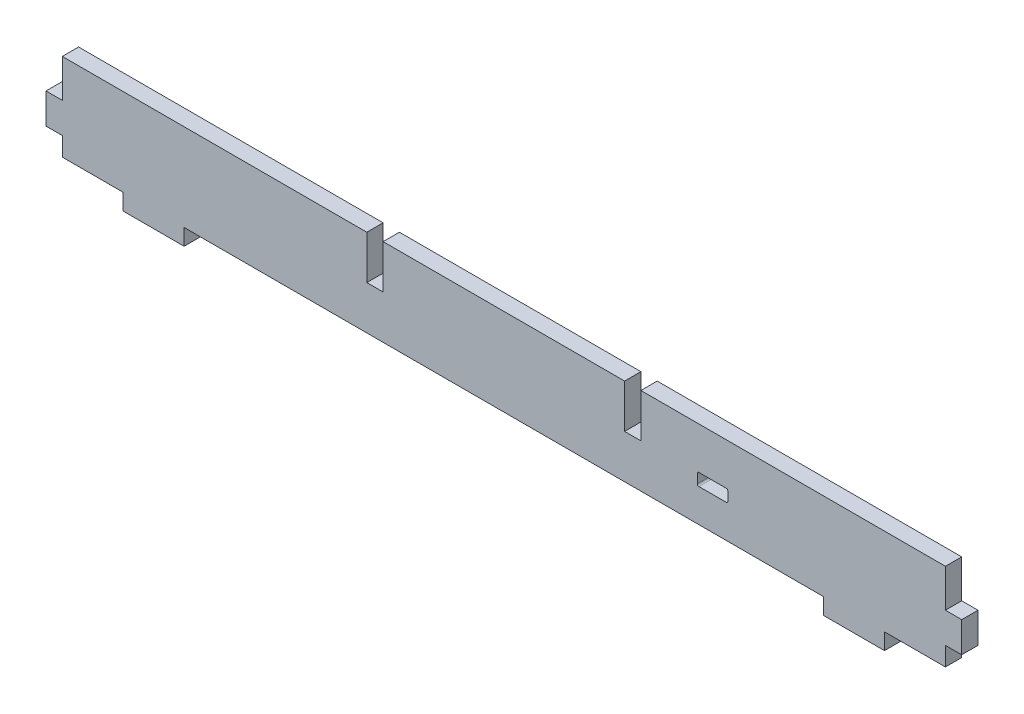
ISO-10303-21;
HEADER;
FILE_DESCRIPTION(('STEP AP214'),'2;1');
FILE_NAME('part.step','',(''),(''),'','','');
FILE_SCHEMA(('AUTOMOTIVE_DESIGN { 1 0 10303 214 1 1 1 1 }'));
ENDSEC;
DATA;
#1=APPLICATION_CONTEXT('core data for automotive mechanical design processes');
#2=APPLICATION_PROTOCOL_DEFINITION('international standard','automotive_design',2000,#1);
#3=PRODUCT_CONTEXT('',#1,'mechanical');
#4=PRODUCT('Part','Part','',(#3));
#5=PRODUCT_RELATED_PRODUCT_CATEGORY('part','',(#4));
#6=PRODUCT_DEFINITION_FORMATION('','',#4);
#7=PRODUCT_DEFINITION_CONTEXT('part definition',#1,'design');
#8=PRODUCT_DEFINITION('design','',#6,#7);
#9=PRODUCT_DEFINITION_SHAPE('','',#8);
#10=(LENGTH_UNIT() NAMED_UNIT(*) SI_UNIT(.MILLI.,.METRE.));
#11=(NAMED_UNIT(*) PLANE_ANGLE_UNIT() SI_UNIT($,.RADIAN.));
#12=(NAMED_UNIT(*) SI_UNIT($,.STERADIAN.) SOLID_ANGLE_UNIT());
#13=UNCERTAINTY_MEASURE_WITH_UNIT(LENGTH_MEASURE(1.E-05),#10,'distance_accuracy_value','');
#14=(GEOMETRIC_REPRESENTATION_CONTEXT(3) GLOBAL_UNCERTAINTY_ASSIGNED_CONTEXT((#13)) GLOBAL_UNIT_ASSIGNED_CONTEXT((#10,
#11,#12)) REPRESENTATION_CONTEXT('',''));
#15=CARTESIAN_POINT('',(0.,0.,0.));
#16=DIRECTION('',(0.,0.,1.));
#17=DIRECTION('',(1.,0.,0.));
#18=AXIS2_PLACEMENT_3D('',#15,#16,#17);
#19=CARTESIAN_POINT('',(0.,0.,5.35));
#20=DIRECTION('',(0.,0.,1.));
#21=DIRECTION('',(1.,0.,0.));
#22=AXIS2_PLACEMENT_3D('',#19,#20,#21);
#23=PLANE('',#22);
#24=DIRECTION('',(0.,-1.,0.));
#25=VECTOR('',#24,1.);
#26=CARTESIAN_POINT('',(-145.,0.,5.35));
#27=LINE('',#26,#25);
#28=CARTESIAN_POINT('',(-145.,6.15,5.35));
#29=VERTEX_POINT('',#28);
#30=CARTESIAN_POINT('',(-145.,0.,5.35));
#31=VERTEX_POINT('',#30);
#32=EDGE_CURVE('E330',#29,#31,#27,.T.);
#33=ORIENTED_EDGE('',*,*,#32,.T.);
#34=DIRECTION('',(1.,0.,0.));
#35=VECTOR('',#34,1.);
#36=CARTESIAN_POINT('',(-145.,0.,5.35));
#37=LINE('',#36,#35);
#38=CARTESIAN_POINT('',(-125.,0.,5.35));
#39=VERTEX_POINT('',#38);
#40=EDGE_CURVE('E333',#31,#39,#37,.T.);
#41=ORIENTED_EDGE('',*,*,#40,.T.);
#42=DIRECTION('',(0.,-1.,0.));
#43=VECTOR('',#42,1.);
#44=CARTESIAN_POINT('',(-125.,0.,5.35));
#45=LINE('',#44,#43);
#46=CARTESIAN_POINT('',(-125.,-5.35,5.35));
#47=VERTEX_POINT('',#46);
#48=EDGE_CURVE('E336',#39,#47,#45,.T.);
#49=ORIENTED_EDGE('',*,*,#48,.T.);
#50=DIRECTION('',(1.,0.,0.));
#51=VECTOR('',#50,1.);
#52=CARTESIAN_POINT('',(-125.,-5.35,5.35));
#53=LINE('',#52,#51);
#54=CARTESIAN_POINT('',(-105.,-5.35,5.35));
#55=VERTEX_POINT('',#54);
#56=EDGE_CURVE('E338',#47,#55,#53,.T.);
#57=ORIENTED_EDGE('',*,*,#56,.T.);
#58=DIRECTION('',(0.,1.,0.));
#59=VECTOR('',#58,1.);
#60=CARTESIAN_POINT('',(-105.,0.,5.35));
#61=LINE('',#60,#59);
#62=CARTESIAN_POINT('',(-105.,0.,5.35));
#63=VERTEX_POINT('',#62);
#64=EDGE_CURVE('E340',#55,#63,#61,.T.);
#65=ORIENTED_EDGE('',*,*,#64,.T.);
#66=DIRECTION('',(1.,0.,0.));
#67=VECTOR('',#66,1.);
#68=CARTESIAN_POINT('',(-105.,0.,5.35));
#69=LINE('',#68,#67);
#70=CARTESIAN_POINT('',(105.,0.,5.35));
#71=VERTEX_POINT('',#70);
#72=EDGE_CURVE('E342',#63,#71,#69,.T.);
#73=ORIENTED_EDGE('',*,*,#72,.T.);
#74=DIRECTION('',(0.,-1.,0.));
#75=VECTOR('',#74,1.);
#76=CARTESIAN_POINT('',(105.,0.,5.35));
#77=LINE('',#76,#75);
#78=CARTESIAN_POINT('',(105.,-5.35,5.35));
#79=VERTEX_POINT('',#78);
#80=EDGE_CURVE('E344',#71,#79,#77,.T.);
#81=ORIENTED_EDGE('',*,*,#80,.T.);
#82=DIRECTION('',(1.,0.,0.));
#83=VECTOR('',#82,1.);
#84=CARTESIAN_POINT('',(125.,-5.35,5.35));
#85=LINE('',#84,#83);
#86=CARTESIAN_POINT('',(125.,-5.35,5.35));
#87=VERTEX_POINT('',#86);
#88=EDGE_CURVE('E346',#79,#87,#85,.T.);
#89=ORIENTED_EDGE('',*,*,#88,.T.);
#90=DIRECTION('',(0.,1.,0.));
#91=VECTOR('',#90,1.);
#92=CARTESIAN_POINT('',(125.,0.,5.35));
#93=LINE('',#92,#91);
#94=CARTESIAN_POINT('',(125.,0.,5.35));
#95=VERTEX_POINT('',#94);
#96=EDGE_CURVE('E348',#87,#95,#93,.T.);
#97=ORIENTED_EDGE('',*,*,#96,.T.);
#98=DIRECTION('',(1.,0.,0.));
#99=VECTOR('',#98,1.);
#100=CARTESIAN_POINT('',(125.,0.,5.35));
#101=LINE('',#100,#99);
#102=CARTESIAN_POINT('',(145.,0.,5.35));
#103=VERTEX_POINT('',#102);
#104=EDGE_CURVE('E350',#95,#103,#101,.T.);
#105=ORIENTED_EDGE('',*,*,#104,.T.);
#106=DIRECTION('',(0.,1.,0.));
#107=VECTOR('',#106,1.);
#108=CARTESIAN_POINT('',(145.,0.,5.35));
#109=LINE('',#108,#107);
#110=CARTESIAN_POINT('',(145.,6.15,5.35));
#111=VERTEX_POINT('',#110);
#112=EDGE_CURVE('E352',#103,#111,#109,.T.);
#113=ORIENTED_EDGE('',*,*,#112,.T.);
#114=DIRECTION('',(1.,0.,0.));
#115=VECTOR('',#114,1.);
#116=CARTESIAN_POINT('',(145.,6.15,5.35));
#117=LINE('',#116,#115);
#118=CARTESIAN_POINT('',(150.35,6.15,5.35));
#119=VERTEX_POINT('',#118);
#120=EDGE_CURVE('E354',#111,#119,#117,.T.);
#121=ORIENTED_EDGE('',*,*,#120,.T.);
#122=DIRECTION('',(0.,1.,0.));
#123=VECTOR('',#122,1.);
#124=CARTESIAN_POINT('',(150.35,6.15,5.35));
#125=LINE('',#124,#123);
#126=CARTESIAN_POINT('',(150.35,16.15,5.35));
#127=VERTEX_POINT('',#126);
#128=EDGE_CURVE('E356',#119,#127,#125,.T.);
#129=ORIENTED_EDGE('',*,*,#128,.T.);
#130=DIRECTION('',(-1.,0.,0.));
#131=VECTOR('',#130,1.);
#132=CARTESIAN_POINT('',(145.,16.15,5.35));
#133=LINE('',#132,#131);
#134=CARTESIAN_POINT('',(145.,16.15,5.35));
#135=VERTEX_POINT('',#134);
#136=EDGE_CURVE('E358',#127,#135,#133,.T.);
#137=ORIENTED_EDGE('',*,*,#136,.T.);
#138=DIRECTION('',(0.,1.,0.));
#139=VECTOR('',#138,1.);
#140=CARTESIAN_POINT('',(145.,16.15,5.35));
#141=LINE('',#140,#139);
#142=CARTESIAN_POINT('',(145.,28.65,5.35));
#143=VERTEX_POINT('',#142);
#144=EDGE_CURVE('E360',#135,#143,#141,.T.);
#145=ORIENTED_EDGE('',*,*,#144,.T.);
#146=DIRECTION('',(-1.,0.,0.));
#147=VECTOR('',#146,1.);
#148=CARTESIAN_POINT('',(45.,28.65,5.35));
#149=LINE('',#148,#147);
#150=CARTESIAN_POINT('',(45.,28.65,5.35));
#151=VERTEX_POINT('',#150);
#152=EDGE_CURVE('E362',#143,#151,#149,.T.);
#153=ORIENTED_EDGE('',*,*,#152,.T.);
#154=DIRECTION('',(0.,-1.,0.));
#155=VECTOR('',#154,1.);
#156=CARTESIAN_POINT('',(45.,28.65,5.35));
#157=LINE('',#156,#155);
#158=CARTESIAN_POINT('',(45.,14.325,5.35));
#159=VERTEX_POINT('',#158);
#160=EDGE_CURVE('E364',#151,#159,#157,.T.);
#161=ORIENTED_EDGE('',*,*,#160,.T.);
#162=DIRECTION('',(-1.,0.,0.));
#163=VECTOR('',#162,1.);
#164=CARTESIAN_POINT('',(45.,14.325,5.35));
#165=LINE('',#164,#163);
#166=CARTESIAN_POINT('',(39.65,14.325,5.35));
#167=VERTEX_POINT('',#166);
#168=EDGE_CURVE('E366',#159,#167,#165,.T.);
#169=ORIENTED_EDGE('',*,*,#168,.T.);
#170=DIRECTION('',(0.,1.,0.));
#171=VECTOR('',#170,1.);
#172=CARTESIAN_POINT('',(39.65,28.65,5.35));
#173=LINE('',#172,#171);
#174=CARTESIAN_POINT('',(39.65,28.65,5.35));
#175=VERTEX_POINT('',#174);
#176=EDGE_CURVE('E368',#167,#175,#173,.T.);
#177=ORIENTED_EDGE('',*,*,#176,.T.);
#178=DIRECTION('',(-1.,0.,0.));
#179=VECTOR('',#178,1.);
#180=CARTESIAN_POINT('',(-39.65,28.65,5.35));
#181=LINE('',#180,#179);
#182=CARTESIAN_POINT('',(-39.65,28.65,5.35));
#183=VERTEX_POINT('',#182);
#184=EDGE_CURVE('E370',#175,#183,#181,.T.);
#185=ORIENTED_EDGE('',*,*,#184,.T.);
#186=DIRECTION('',(0.,-1.,0.));
#187=VECTOR('',#186,1.);
#188=CARTESIAN_POINT('',(-39.65,28.65,5.35));
#189=LINE('',#188,#187);
#190=CARTESIAN_POINT('',(-39.65,14.325,5.35));
#191=VERTEX_POINT('',#190);
#192=EDGE_CURVE('E372',#183,#191,#189,.T.);
#193=ORIENTED_EDGE('',*,*,#192,.T.);
#194=DIRECTION('',(-1.,0.,0.));
#195=VECTOR('',#194,1.);
#196=CARTESIAN_POINT('',(-45.,14.325,5.35));
#197=LINE('',#196,#195);
#198=CARTESIAN_POINT('',(-45.,14.325,5.35));
#199=VERTEX_POINT('',#198);
#200=EDGE_CURVE('E374',#191,#199,#197,.T.);
#201=ORIENTED_EDGE('',*,*,#200,.T.);
#202=DIRECTION('',(0.,1.,0.));
#203=VECTOR('',#202,1.);
#204=CARTESIAN_POINT('',(-45.,28.65,5.35));
#205=LINE('',#204,#203);
#206=CARTESIAN_POINT('',(-45.,28.65,5.35));
#207=VERTEX_POINT('',#206);
#208=EDGE_CURVE('E376',#199,#207,#205,.T.);
#209=ORIENTED_EDGE('',*,*,#208,.T.);
#210=DIRECTION('',(-1.,0.,0.));
#211=VECTOR('',#210,1.);
#212=CARTESIAN_POINT('',(-145.,28.65,5.35));
#213=LINE('',#212,#211);
#214=CARTESIAN_POINT('',(-145.,28.65,5.35));
#215=VERTEX_POINT('',#214);
#216=EDGE_CURVE('E378',#207,#215,#213,.T.);
#217=ORIENTED_EDGE('',*,*,#216,.T.);
#218=DIRECTION('',(0.,-1.,0.));
#219=VECTOR('',#218,1.);
#220=CARTESIAN_POINT('',(-145.,16.15,5.35));
#221=LINE('',#220,#219);
#222=CARTESIAN_POINT('',(-145.,16.15,5.35));
#223=VERTEX_POINT('',#222);
#224=EDGE_CURVE('E380',#215,#223,#221,.T.);
#225=ORIENTED_EDGE('',*,*,#224,.T.);
#226=DIRECTION('',(-1.,0.,0.));
#227=VECTOR('',#226,1.);
#228=CARTESIAN_POINT('',(-145.,16.15,5.35));
#229=LINE('',#228,#227);
#230=CARTESIAN_POINT('',(-150.35,16.15,5.35));
#231=VERTEX_POINT('',#230);
#232=EDGE_CURVE('E382',#223,#231,#229,.T.);
#233=ORIENTED_EDGE('',*,*,#232,.T.);
#234=DIRECTION('',(0.,-1.,0.));
#235=VECTOR('',#234,1.);
#236=CARTESIAN_POINT('',(-150.35,6.15,5.35));
#237=LINE('',#236,#235);
#238=CARTESIAN_POINT('',(-150.35,6.15,5.35));
#239=VERTEX_POINT('',#238);
#240=EDGE_CURVE('E384',#231,#239,#237,.T.);
#241=ORIENTED_EDGE('',*,*,#240,.T.);
#242=DIRECTION('',(1.,0.,0.));
#243=VECTOR('',#242,1.);
#244=CARTESIAN_POINT('',(-145.,6.15,5.35));
#245=LINE('',#244,#243);
#246=EDGE_CURVE('E386',#239,#29,#245,.T.);
#247=ORIENTED_EDGE('',*,*,#246,.T.);
#248=EDGE_LOOP('',(#33,#41,#49,#57,#65,#73,#81,#89,#97,#105,#113,#121,#129,#137,#145,#153,#161,
#169,#177,#185,#193,#201,#209,#217,#225,#233,#241,#247));
#249=FACE_BOUND('',#248,.T.);
#250=DIRECTION('',(1.,0.,0.));
#251=VECTOR('',#250,1.);
#252=CARTESIAN_POINT('',(64.04,10.85,5.35));
#253=LINE('',#252,#251);
#254=CARTESIAN_POINT('',(64.04,10.85,5.35));
#255=VERTEX_POINT('',#254);
#256=CARTESIAN_POINT('',(73.04,10.85,5.35));
#257=VERTEX_POINT('',#256);
#258=EDGE_CURVE('E273',#255,#257,#253,.T.);
#259=ORIENTED_EDGE('',*,*,#258,.F.);
#260=CARTESIAN_POINT('',(64.04,11.35,5.35));
#261=DIRECTION('',(0.,0.,1.));
#262=DIRECTION('',(1.,0.,0.));
#263=AXIS2_PLACEMENT_3D('',#260,#261,#262);
#264=CIRCLE('',#263,0.500000000000001);
#265=CARTESIAN_POINT('',(63.54,11.35,5.35));
#266=VERTEX_POINT('',#265);
#267=EDGE_CURVE('E265',#266,#255,#264,.T.);
#268=ORIENTED_EDGE('',*,*,#267,.F.);
#269=DIRECTION('',(0.,-1.,0.));
#270=VECTOR('',#269,1.);
#271=CARTESIAN_POINT('',(63.54,14.35,5.35));
#272=LINE('',#271,#270);
#273=CARTESIAN_POINT('',(63.54,14.35,5.35));
#274=VERTEX_POINT('',#273);
#275=EDGE_CURVE('E298',#274,#266,#272,.T.);
#276=ORIENTED_EDGE('',*,*,#275,.F.);
#277=CARTESIAN_POINT('',(64.04,14.35,5.35));
#278=DIRECTION('',(0.,0.,1.));
#279=DIRECTION('',(1.,0.,0.));
#280=AXIS2_PLACEMENT_3D('',#277,#278,#279);
#281=CIRCLE('',#280,0.5);
#282=CARTESIAN_POINT('',(64.04,14.85,5.35));
#283=VERTEX_POINT('',#282);
#284=EDGE_CURVE('E296',#283,#274,#281,.T.);
#285=ORIENTED_EDGE('',*,*,#284,.F.);
#286=DIRECTION('',(-1.,0.,0.));
#287=VECTOR('',#286,1.);
#288=CARTESIAN_POINT('',(64.04,14.85,5.35));
#289=LINE('',#288,#287);
#290=CARTESIAN_POINT('',(73.04,14.85,5.35));
#291=VERTEX_POINT('',#290);
#292=EDGE_CURVE('E294',#291,#283,#289,.T.);
#293=ORIENTED_EDGE('',*,*,#292,.F.);
#294=CARTESIAN_POINT('',(73.04,14.35,5.35));
#295=DIRECTION('',(0.,0.,1.));
#296=DIRECTION('',(1.,0.,0.));
#297=AXIS2_PLACEMENT_3D('',#294,#295,#296);
#298=CIRCLE('',#297,0.5);
#299=CARTESIAN_POINT('',(73.54,14.35,5.35));
#300=VERTEX_POINT('',#299);
#301=EDGE_CURVE('E292',#300,#291,#298,.T.);
#302=ORIENTED_EDGE('',*,*,#301,.F.);
#303=DIRECTION('',(0.,1.,0.));
#304=VECTOR('',#303,1.);
#305=CARTESIAN_POINT('',(73.54,14.35,5.35));
#306=LINE('',#305,#304);
#307=CARTESIAN_POINT('',(73.54,11.35,5.35));
#308=VERTEX_POINT('',#307);
#309=EDGE_CURVE('E288',#308,#300,#306,.T.);
#310=ORIENTED_EDGE('',*,*,#309,.F.);
#311=CARTESIAN_POINT('',(73.04,11.35,5.35));
#312=DIRECTION('',(0.,0.,1.));
#313=DIRECTION('',(1.,0.,0.));
#314=AXIS2_PLACEMENT_3D('',#311,#312,#313);
#315=CIRCLE('',#314,0.500000000000001);
#316=EDGE_CURVE('E286',#257,#308,#315,.T.);
#317=ORIENTED_EDGE('',*,*,#316,.F.);
#318=EDGE_LOOP('',(#259,#268,#276,#285,#293,#302,#310,#317));
#319=FACE_BOUND('',#318,.T.);
#320=ADVANCED_FACE('F32',(#249,#319),#23,.T.);
#321=CARTESIAN_POINT('',(0.,0.,0.));
#322=DIRECTION('',(0.,0.,1.));
#323=DIRECTION('',(1.,0.,0.));
#324=AXIS2_PLACEMENT_3D('',#321,#322,#323);
#325=PLANE('',#324);
#326=DIRECTION('',(0.,-1.,0.));
#327=VECTOR('',#326,1.);
#328=CARTESIAN_POINT('',(-145.,0.,0.));
#329=LINE('',#328,#327);
#330=CARTESIAN_POINT('',(-145.,6.15,0.));
#331=VERTEX_POINT('',#330);
#332=CARTESIAN_POINT('',(-145.,0.,0.));
#333=VERTEX_POINT('',#332);
#334=EDGE_CURVE('E281',#331,#333,#329,.T.);
#335=ORIENTED_EDGE('',*,*,#334,.F.);
#336=DIRECTION('',(1.,0.,0.));
#337=VECTOR('',#336,1.);
#338=CARTESIAN_POINT('',(-145.,6.15,0.));
#339=LINE('',#338,#337);
#340=CARTESIAN_POINT('',(-150.35,6.15,0.));
#341=VERTEX_POINT('',#340);
#342=EDGE_CURVE('E334',#341,#331,#339,.T.);
#343=ORIENTED_EDGE('',*,*,#342,.F.);
#344=DIRECTION('',(0.,-1.,0.));
#345=VECTOR('',#344,1.);
#346=CARTESIAN_POINT('',(-150.35,6.15,0.));
#347=LINE('',#346,#345);
#348=CARTESIAN_POINT('',(-150.35,16.15,0.));
#349=VERTEX_POINT('',#348);
#350=EDGE_CURVE('E441',#349,#341,#347,.T.);
#351=ORIENTED_EDGE('',*,*,#350,.F.);
#352=DIRECTION('',(-1.,0.,0.));
#353=VECTOR('',#352,1.);
#354=CARTESIAN_POINT('',(-145.,16.15,0.));
#355=LINE('',#354,#353);
#356=CARTESIAN_POINT('',(-145.,16.15,0.));
#357=VERTEX_POINT('',#356);
#358=EDGE_CURVE('E439',#357,#349,#355,.T.);
#359=ORIENTED_EDGE('',*,*,#358,.F.);
#360=DIRECTION('',(0.,-1.,0.));
#361=VECTOR('',#360,1.);
#362=CARTESIAN_POINT('',(-145.,16.15,0.));
#363=LINE('',#362,#361);
#364=CARTESIAN_POINT('',(-145.,28.65,0.));
#365=VERTEX_POINT('',#364);
#366=EDGE_CURVE('E437',#365,#357,#363,.T.);
#367=ORIENTED_EDGE('',*,*,#366,.F.);
#368=DIRECTION('',(-1.,0.,0.));
#369=VECTOR('',#368,1.);
#370=CARTESIAN_POINT('',(-145.,28.65,0.));
#371=LINE('',#370,#369);
#372=CARTESIAN_POINT('',(-45.,28.65,0.));
#373=VERTEX_POINT('',#372);
#374=EDGE_CURVE('E435',#373,#365,#371,.T.);
#375=ORIENTED_EDGE('',*,*,#374,.F.);
#376=DIRECTION('',(0.,1.,0.));
#377=VECTOR('',#376,1.);
#378=CARTESIAN_POINT('',(-45.,28.65,0.));
#379=LINE('',#378,#377);
#380=CARTESIAN_POINT('',(-45.,14.325,0.));
#381=VERTEX_POINT('',#380);
#382=EDGE_CURVE('E433',#381,#373,#379,.T.);
#383=ORIENTED_EDGE('',*,*,#382,.F.);
#384=DIRECTION('',(-1.,0.,0.));
#385=VECTOR('',#384,1.);
#386=CARTESIAN_POINT('',(-45.,14.325,0.));
#387=LINE('',#386,#385);
#388=CARTESIAN_POINT('',(-39.65,14.325,0.));
#389=VERTEX_POINT('',#388);
#390=EDGE_CURVE('E431',#389,#381,#387,.T.);
#391=ORIENTED_EDGE('',*,*,#390,.F.);
#392=DIRECTION('',(0.,-1.,0.));
#393=VECTOR('',#392,1.);
#394=CARTESIAN_POINT('',(-39.65,28.65,0.));
#395=LINE('',#394,#393);
#396=CARTESIAN_POINT('',(-39.65,28.65,0.));
#397=VERTEX_POINT('',#396);
#398=EDGE_CURVE('E429',#397,#389,#395,.T.);
#399=ORIENTED_EDGE('',*,*,#398,.F.);
#400=DIRECTION('',(-1.,0.,0.));
#401=VECTOR('',#400,1.);
#402=CARTESIAN_POINT('',(-39.65,28.65,0.));
#403=LINE('',#402,#401);
#404=CARTESIAN_POINT('',(39.65,28.65,0.));
#405=VERTEX_POINT('',#404);
#406=EDGE_CURVE('E427',#405,#397,#403,.T.);
#407=ORIENTED_EDGE('',*,*,#406,.F.);
#408=DIRECTION('',(0.,1.,0.));
#409=VECTOR('',#408,1.);
#410=CARTESIAN_POINT('',(39.65,28.65,0.));
#411=LINE('',#410,#409);
#412=CARTESIAN_POINT('',(39.65,14.325,0.));
#413=VERTEX_POINT('',#412);
#414=EDGE_CURVE('E425',#413,#405,#411,.T.);
#415=ORIENTED_EDGE('',*,*,#414,.F.);
#416=DIRECTION('',(-1.,0.,0.));
#417=VECTOR('',#416,1.);
#418=CARTESIAN_POINT('',(45.,14.325,0.));
#419=LINE('',#418,#417);
#420=CARTESIAN_POINT('',(45.,14.325,0.));
#421=VERTEX_POINT('',#420);
#422=EDGE_CURVE('E423',#421,#413,#419,.T.);
#423=ORIENTED_EDGE('',*,*,#422,.F.);
#424=DIRECTION('',(0.,-1.,0.));
#425=VECTOR('',#424,1.);
#426=CARTESIAN_POINT('',(45.,28.65,0.));
#427=LINE('',#426,#425);
#428=CARTESIAN_POINT('',(45.,28.65,0.));
#429=VERTEX_POINT('',#428);
#430=EDGE_CURVE('E421',#429,#421,#427,.T.);
#431=ORIENTED_EDGE('',*,*,#430,.F.);
#432=DIRECTION('',(-1.,0.,0.));
#433=VECTOR('',#432,1.);
#434=CARTESIAN_POINT('',(45.,28.65,0.));
#435=LINE('',#434,#433);
#436=CARTESIAN_POINT('',(145.,28.65,0.));
#437=VERTEX_POINT('',#436);
#438=EDGE_CURVE('E419',#437,#429,#435,.T.);
#439=ORIENTED_EDGE('',*,*,#438,.F.);
#440=DIRECTION('',(0.,1.,0.));
#441=VECTOR('',#440,1.);
#442=CARTESIAN_POINT('',(145.,16.15,0.));
#443=LINE('',#442,#441);
#444=CARTESIAN_POINT('',(145.,16.15,0.));
#445=VERTEX_POINT('',#444);
#446=EDGE_CURVE('E417',#445,#437,#443,.T.);
#447=ORIENTED_EDGE('',*,*,#446,.F.);
#448=DIRECTION('',(-1.,0.,0.));
#449=VECTOR('',#448,1.);
#450=CARTESIAN_POINT('',(145.,16.15,0.));
#451=LINE('',#450,#449);
#452=CARTESIAN_POINT('',(150.35,16.15,0.));
#453=VERTEX_POINT('',#452);
#454=EDGE_CURVE('E415',#453,#445,#451,.T.);
#455=ORIENTED_EDGE('',*,*,#454,.F.);
#456=DIRECTION('',(0.,1.,0.));
#457=VECTOR('',#456,1.);
#458=CARTESIAN_POINT('',(150.35,6.15,0.));
#459=LINE('',#458,#457);
#460=CARTESIAN_POINT('',(150.35,6.15,0.));
#461=VERTEX_POINT('',#460);
#462=EDGE_CURVE('E413',#461,#453,#459,.T.);
#463=ORIENTED_EDGE('',*,*,#462,.F.);
#464=DIRECTION('',(1.,0.,0.));
#465=VECTOR('',#464,1.);
#466=CARTESIAN_POINT('',(145.,6.15,0.));
#467=LINE('',#466,#465);
#468=CARTESIAN_POINT('',(145.,6.15,0.));
#469=VERTEX_POINT('',#468);
#470=EDGE_CURVE('E411',#469,#461,#467,.T.);
#471=ORIENTED_EDGE('',*,*,#470,.F.);
#472=DIRECTION('',(0.,1.,0.));
#473=VECTOR('',#472,1.);
#474=CARTESIAN_POINT('',(145.,0.,0.));
#475=LINE('',#474,#473);
#476=CARTESIAN_POINT('',(145.,0.,0.));
#477=VERTEX_POINT('',#476);
#478=EDGE_CURVE('E409',#477,#469,#475,.T.);
#479=ORIENTED_EDGE('',*,*,#478,.F.);
#480=DIRECTION('',(1.,0.,0.));
#481=VECTOR('',#480,1.);
#482=CARTESIAN_POINT('',(125.,0.,0.));
#483=LINE('',#482,#481);
#484=CARTESIAN_POINT('',(125.,0.,0.));
#485=VERTEX_POINT('',#484);
#486=EDGE_CURVE('E407',#485,#477,#483,.T.);
#487=ORIENTED_EDGE('',*,*,#486,.F.);
#488=DIRECTION('',(0.,1.,0.));
#489=VECTOR('',#488,1.);
#490=CARTESIAN_POINT('',(125.,0.,0.));
#491=LINE('',#490,#489);
#492=CARTESIAN_POINT('',(125.,-5.35,0.));
#493=VERTEX_POINT('',#492);
#494=EDGE_CURVE('E405',#493,#485,#491,.T.);
#495=ORIENTED_EDGE('',*,*,#494,.F.);
#496=DIRECTION('',(1.,0.,0.));
#497=VECTOR('',#496,1.);
#498=CARTESIAN_POINT('',(125.,-5.35,0.));
#499=LINE('',#498,#497);
#500=CARTESIAN_POINT('',(105.,-5.35,0.));
#501=VERTEX_POINT('',#500);
#502=EDGE_CURVE('E403',#501,#493,#499,.T.);
#503=ORIENTED_EDGE('',*,*,#502,.F.);
#504=DIRECTION('',(0.,-1.,0.));
#505=VECTOR('',#504,1.);
#506=CARTESIAN_POINT('',(105.,0.,0.));
#507=LINE('',#506,#505);
#508=CARTESIAN_POINT('',(105.,0.,0.));
#509=VERTEX_POINT('',#508);
#510=EDGE_CURVE('E401',#509,#501,#507,.T.);
#511=ORIENTED_EDGE('',*,*,#510,.F.);
#512=DIRECTION('',(1.,0.,0.));
#513=VECTOR('',#512,1.);
#514=CARTESIAN_POINT('',(-105.,0.,0.));
#515=LINE('',#514,#513);
#516=CARTESIAN_POINT('',(-105.,0.,0.));
#517=VERTEX_POINT('',#516);
#518=EDGE_CURVE('E399',#517,#509,#515,.T.);
#519=ORIENTED_EDGE('',*,*,#518,.F.);
#520=DIRECTION('',(0.,1.,0.));
#521=VECTOR('',#520,1.);
#522=CARTESIAN_POINT('',(-105.,0.,0.));
#523=LINE('',#522,#521);
#524=CARTESIAN_POINT('',(-105.,-5.35,0.));
#525=VERTEX_POINT('',#524);
#526=EDGE_CURVE('E397',#525,#517,#523,.T.);
#527=ORIENTED_EDGE('',*,*,#526,.F.);
#528=DIRECTION('',(1.,0.,0.));
#529=VECTOR('',#528,1.);
#530=CARTESIAN_POINT('',(-125.,-5.35,0.));
#531=LINE('',#530,#529);
#532=CARTESIAN_POINT('',(-125.,-5.35,0.));
#533=VERTEX_POINT('',#532);
#534=EDGE_CURVE('E395',#533,#525,#531,.T.);
#535=ORIENTED_EDGE('',*,*,#534,.F.);
#536=DIRECTION('',(0.,-1.,0.));
#537=VECTOR('',#536,1.);
#538=CARTESIAN_POINT('',(-125.,0.,0.));
#539=LINE('',#538,#537);
#540=CARTESIAN_POINT('',(-125.,0.,0.));
#541=VERTEX_POINT('',#540);
#542=EDGE_CURVE('E393',#541,#533,#539,.T.);
#543=ORIENTED_EDGE('',*,*,#542,.F.);
#544=DIRECTION('',(1.,0.,0.));
#545=VECTOR('',#544,1.);
#546=CARTESIAN_POINT('',(-145.,0.,0.));
#547=LINE('',#546,#545);
#548=EDGE_CURVE('E391',#333,#541,#547,.T.);
#549=ORIENTED_EDGE('',*,*,#548,.F.);
#550=EDGE_LOOP('',(#335,#343,#351,#359,#367,#375,#383,#391,#399,#407,#415,#423,#431,#439,#447,
#455,#463,#471,#479,#487,#495,#503,#511,#519,#527,#535,#543,#549));
#551=FACE_BOUND('',#550,.T.);
#552=CARTESIAN_POINT('',(64.04,11.35,0.));
#553=DIRECTION('',(0.,0.,1.));
#554=DIRECTION('',(1.,0.,0.));
#555=AXIS2_PLACEMENT_3D('',#552,#553,#554);
#556=CIRCLE('',#555,0.500000000000001);
#557=CARTESIAN_POINT('',(63.54,11.35,0.));
#558=VERTEX_POINT('',#557);
#559=CARTESIAN_POINT('',(64.04,10.85,0.));
#560=VERTEX_POINT('',#559);
#561=EDGE_CURVE('E55',#558,#560,#556,.T.);
#562=ORIENTED_EDGE('',*,*,#561,.T.);
#563=DIRECTION('',(1.,0.,0.));
#564=VECTOR('',#563,1.);
#565=CARTESIAN_POINT('',(64.04,10.85,0.));
#566=LINE('',#565,#564);
#567=CARTESIAN_POINT('',(73.04,10.85,0.));
#568=VERTEX_POINT('',#567);
#569=EDGE_CURVE('E280',#560,#568,#566,.T.);
#570=ORIENTED_EDGE('',*,*,#569,.T.);
#571=CARTESIAN_POINT('',(73.04,11.35,0.));
#572=DIRECTION('',(0.,0.,1.));
#573=DIRECTION('',(1.,0.,0.));
#574=AXIS2_PLACEMENT_3D('',#571,#572,#573);
#575=CIRCLE('',#574,0.500000000000001);
#576=CARTESIAN_POINT('',(73.54,11.35,0.));
#577=VERTEX_POINT('',#576);
#578=EDGE_CURVE('E302',#568,#577,#575,.T.);
#579=ORIENTED_EDGE('',*,*,#578,.T.);
#580=DIRECTION('',(0.,1.,0.));
#581=VECTOR('',#580,1.);
#582=CARTESIAN_POINT('',(73.54,14.35,0.));
#583=LINE('',#582,#581);
#584=CARTESIAN_POINT('',(73.54,14.35,0.));
#585=VERTEX_POINT('',#584);
#586=EDGE_CURVE('E305',#577,#585,#583,.T.);
#587=ORIENTED_EDGE('',*,*,#586,.T.);
#588=CARTESIAN_POINT('',(73.04,14.35,0.));
#589=DIRECTION('',(0.,0.,1.));
#590=DIRECTION('',(1.,0.,0.));
#591=AXIS2_PLACEMENT_3D('',#588,#589,#590);
#592=CIRCLE('',#591,0.5);
#593=CARTESIAN_POINT('',(73.04,14.85,0.));
#594=VERTEX_POINT('',#593);
#595=EDGE_CURVE('E308',#585,#594,#592,.T.);
#596=ORIENTED_EDGE('',*,*,#595,.T.);
#597=DIRECTION('',(-1.,0.,0.));
#598=VECTOR('',#597,1.);
#599=CARTESIAN_POINT('',(64.04,14.85,0.));
#600=LINE('',#599,#598);
#601=CARTESIAN_POINT('',(64.04,14.85,0.));
#602=VERTEX_POINT('',#601);
#603=EDGE_CURVE('E311',#594,#602,#600,.T.);
#604=ORIENTED_EDGE('',*,*,#603,.T.);
#605=CARTESIAN_POINT('',(64.04,14.35,0.));
#606=DIRECTION('',(0.,0.,1.));
#607=DIRECTION('',(1.,0.,0.));
#608=AXIS2_PLACEMENT_3D('',#605,#606,#607);
#609=CIRCLE('',#608,0.5);
#610=CARTESIAN_POINT('',(63.54,14.35,0.));
#611=VERTEX_POINT('',#610);
#612=EDGE_CURVE('E314',#602,#611,#609,.T.);
#613=ORIENTED_EDGE('',*,*,#612,.T.);
#614=DIRECTION('',(0.,-1.,0.));
#615=VECTOR('',#614,1.);
#616=CARTESIAN_POINT('',(63.54,14.35,0.));
#617=LINE('',#616,#615);
#618=EDGE_CURVE('E274',#611,#558,#617,.T.);
#619=ORIENTED_EDGE('',*,*,#618,.T.);
#620=EDGE_LOOP('',(#562,#570,#579,#587,#596,#604,#613,#619));
#621=FACE_BOUND('',#620,.T.);
#622=ADVANCED_FACE('F531',(#551,#621),#325,.F.);
#623=CARTESIAN_POINT('',(-145.,0.,5.35));
#624=DIRECTION('',(1.,0.,0.));
#625=DIRECTION('',(0.,0.,-1.));
#626=AXIS2_PLACEMENT_3D('',#623,#624,#625);
#627=PLANE('',#626);
#628=ORIENTED_EDGE('',*,*,#334,.T.);
#629=DIRECTION('',(0.,0.,-1.));
#630=VECTOR('',#629,1.);
#631=CARTESIAN_POINT('',(-145.,0.,5.35));
#632=LINE('',#631,#630);
#633=EDGE_CURVE('E11',#31,#333,#632,.T.);
#634=ORIENTED_EDGE('',*,*,#633,.F.);
#635=ORIENTED_EDGE('',*,*,#32,.F.);
#636=DIRECTION('',(0.,0.,-1.));
#637=VECTOR('',#636,1.);
#638=CARTESIAN_POINT('',(-145.,6.15,5.35));
#639=LINE('',#638,#637);
#640=EDGE_CURVE('E388',#29,#331,#639,.T.);
#641=ORIENTED_EDGE('',*,*,#640,.T.);
#642=EDGE_LOOP('',(#628,#634,#635,#641));
#643=FACE_BOUND('',#642,.T.);
#644=ADVANCED_FACE('F34',(#643),#627,.F.);
#645=CARTESIAN_POINT('',(-145.,0.,5.35));
#646=DIRECTION('',(0.,1.,0.));
#647=DIRECTION('',(-1.,0.,0.));
#648=AXIS2_PLACEMENT_3D('',#645,#646,#647);
#649=PLANE('',#648);
#650=ORIENTED_EDGE('',*,*,#548,.T.);
#651=DIRECTION('',(0.,0.,-1.));
#652=VECTOR('',#651,1.);
#653=CARTESIAN_POINT('',(-125.,0.,5.35));
#654=LINE('',#653,#652);
#655=EDGE_CURVE('E40',#39,#541,#654,.T.);
#656=ORIENTED_EDGE('',*,*,#655,.F.);
#657=ORIENTED_EDGE('',*,*,#40,.F.);
#658=ORIENTED_EDGE('',*,*,#633,.T.);
#659=EDGE_LOOP('',(#650,#656,#657,#658));
#660=FACE_BOUND('',#659,.T.);
#661=ADVANCED_FACE('F548',(#660),#649,.F.);
#662=CARTESIAN_POINT('',(-125.,0.,5.35));
#663=DIRECTION('',(1.,0.,0.));
#664=DIRECTION('',(0.,0.,-1.));
#665=AXIS2_PLACEMENT_3D('',#662,#663,#664);
#666=PLANE('',#665);
#667=ORIENTED_EDGE('',*,*,#542,.T.);
#668=DIRECTION('',(0.,0.,-1.));
#669=VECTOR('',#668,1.);
#670=CARTESIAN_POINT('',(-125.,-5.35,5.35));
#671=LINE('',#670,#669);
#672=EDGE_CURVE('E518',#47,#533,#671,.T.);
#673=ORIENTED_EDGE('',*,*,#672,.F.);
#674=ORIENTED_EDGE('',*,*,#48,.F.);
#675=ORIENTED_EDGE('',*,*,#655,.T.);
#676=EDGE_LOOP('',(#667,#673,#674,#675));
#677=FACE_BOUND('',#676,.T.);
#678=ADVANCED_FACE('F525',(#677),#666,.F.);
#679=CARTESIAN_POINT('',(-125.,-5.35,5.35));
#680=DIRECTION('',(0.,1.,0.));
#681=DIRECTION('',(-1.,0.,0.));
#682=AXIS2_PLACEMENT_3D('',#679,#680,#681);
#683=PLANE('',#682);
#684=ORIENTED_EDGE('',*,*,#534,.T.);
#685=DIRECTION('',(0.,0.,-1.));
#686=VECTOR('',#685,1.);
#687=CARTESIAN_POINT('',(-105.,-5.35,5.35));
#688=LINE('',#687,#686);
#689=EDGE_CURVE('E515',#55,#525,#688,.T.);
#690=ORIENTED_EDGE('',*,*,#689,.F.);
#691=ORIENTED_EDGE('',*,*,#56,.F.);
#692=ORIENTED_EDGE('',*,*,#672,.T.);
#693=EDGE_LOOP('',(#684,#690,#691,#692));
#694=FACE_BOUND('',#693,.T.);
#695=ADVANCED_FACE('F537',(#694),#683,.F.);
#696=CARTESIAN_POINT('',(-105.,0.,5.35));
#697=DIRECTION('',(-1.,0.,0.));
#698=DIRECTION('',(0.,0.,1.));
#699=AXIS2_PLACEMENT_3D('',#696,#697,#698);
#700=PLANE('',#699);
#701=ORIENTED_EDGE('',*,*,#526,.T.);
#702=DIRECTION('',(0.,0.,-1.));
#703=VECTOR('',#702,1.);
#704=CARTESIAN_POINT('',(-105.,0.,5.35));
#705=LINE('',#704,#703);
#706=EDGE_CURVE('E512',#63,#517,#705,.T.);
#707=ORIENTED_EDGE('',*,*,#706,.F.);
#708=ORIENTED_EDGE('',*,*,#64,.F.);
#709=ORIENTED_EDGE('',*,*,#689,.T.);
#710=EDGE_LOOP('',(#701,#707,#708,#709));
#711=FACE_BOUND('',#710,.T.);
#712=ADVANCED_FACE('F541',(#711),#700,.F.);
#713=CARTESIAN_POINT('',(-105.,0.,5.35));
#714=DIRECTION('',(0.,1.,0.));
#715=DIRECTION('',(0.,0.,1.));
#716=AXIS2_PLACEMENT_3D('',#713,#714,#715);
#717=PLANE('',#716);
#718=ORIENTED_EDGE('',*,*,#518,.T.);
#719=DIRECTION('',(0.,0.,-1.));
#720=VECTOR('',#719,1.);
#721=CARTESIAN_POINT('',(105.,0.,5.35));
#722=LINE('',#721,#720);
#723=EDGE_CURVE('E509',#71,#509,#722,.T.);
#724=ORIENTED_EDGE('',*,*,#723,.F.);
#725=ORIENTED_EDGE('',*,*,#72,.F.);
#726=ORIENTED_EDGE('',*,*,#706,.T.);
#727=EDGE_LOOP('',(#718,#724,#725,#726));
#728=FACE_BOUND('',#727,.T.);
#729=ADVANCED_FACE('F661',(#728),#717,.F.);
#730=CARTESIAN_POINT('',(105.,0.,5.35));
#731=DIRECTION('',(1.,0.,0.));
#732=DIRECTION('',(0.,0.,-1.));
#733=AXIS2_PLACEMENT_3D('',#730,#731,#732);
#734=PLANE('',#733);
#735=ORIENTED_EDGE('',*,*,#510,.T.);
#736=DIRECTION('',(0.,0.,-1.));
#737=VECTOR('',#736,1.);
#738=CARTESIAN_POINT('',(105.,-5.35,5.35));
#739=LINE('',#738,#737);
#740=EDGE_CURVE('E506',#79,#501,#739,.T.);
#741=ORIENTED_EDGE('',*,*,#740,.F.);
#742=ORIENTED_EDGE('',*,*,#80,.F.);
#743=ORIENTED_EDGE('',*,*,#723,.T.);
#744=EDGE_LOOP('',(#735,#741,#742,#743));
#745=FACE_BOUND('',#744,.T.);
#746=ADVANCED_FACE('F658',(#745),#734,.F.);
#747=CARTESIAN_POINT('',(125.,-5.35,5.35));
#748=DIRECTION('',(0.,1.,0.));
#749=DIRECTION('',(-1.,0.,0.));
#750=AXIS2_PLACEMENT_3D('',#747,#748,#749);
#751=PLANE('',#750);
#752=ORIENTED_EDGE('',*,*,#502,.T.);
#753=DIRECTION('',(0.,0.,-1.));
#754=VECTOR('',#753,1.);
#755=CARTESIAN_POINT('',(125.,-5.35,5.35));
#756=LINE('',#755,#754);
#757=EDGE_CURVE('E503',#87,#493,#756,.T.);
#758=ORIENTED_EDGE('',*,*,#757,.F.);
#759=ORIENTED_EDGE('',*,*,#88,.F.);
#760=ORIENTED_EDGE('',*,*,#740,.T.);
#761=EDGE_LOOP('',(#752,#758,#759,#760));
#762=FACE_BOUND('',#761,.T.);
#763=ADVANCED_FACE('F654',(#762),#751,.F.);
#764=CARTESIAN_POINT('',(125.,0.,5.35));
#765=DIRECTION('',(-1.,0.,0.));
#766=DIRECTION('',(0.,0.,1.));
#767=AXIS2_PLACEMENT_3D('',#764,#765,#766);
#768=PLANE('',#767);
#769=ORIENTED_EDGE('',*,*,#494,.T.);
#770=DIRECTION('',(0.,0.,-1.));
#771=VECTOR('',#770,1.);
#772=CARTESIAN_POINT('',(125.,0.,5.35));
#773=LINE('',#772,#771);
#774=EDGE_CURVE('E500',#95,#485,#773,.T.);
#775=ORIENTED_EDGE('',*,*,#774,.F.);
#776=ORIENTED_EDGE('',*,*,#96,.F.);
#777=ORIENTED_EDGE('',*,*,#757,.T.);
#778=EDGE_LOOP('',(#769,#775,#776,#777));
#779=FACE_BOUND('',#778,.T.);
#780=ADVANCED_FACE('F650',(#779),#768,.F.);
#781=CARTESIAN_POINT('',(125.,0.,5.35));
#782=DIRECTION('',(0.,1.,0.));
#783=DIRECTION('',(0.,0.,1.));
#784=AXIS2_PLACEMENT_3D('',#781,#782,#783);
#785=PLANE('',#784);
#786=ORIENTED_EDGE('',*,*,#486,.T.);
#787=DIRECTION('',(0.,0.,-1.));
#788=VECTOR('',#787,1.);
#789=CARTESIAN_POINT('',(145.,0.,5.35));
#790=LINE('',#789,#788);
#791=EDGE_CURVE('E497',#103,#477,#790,.T.);
#792=ORIENTED_EDGE('',*,*,#791,.F.);
#793=ORIENTED_EDGE('',*,*,#104,.F.);
#794=ORIENTED_EDGE('',*,*,#774,.T.);
#795=EDGE_LOOP('',(#786,#792,#793,#794));
#796=FACE_BOUND('',#795,.T.);
#797=ADVANCED_FACE('F645',(#796),#785,.F.);
#798=CARTESIAN_POINT('',(145.,0.,5.35));
#799=DIRECTION('',(-1.,0.,0.));
#800=DIRECTION('',(0.,0.,1.));
#801=AXIS2_PLACEMENT_3D('',#798,#799,#800);
#802=PLANE('',#801);
#803=ORIENTED_EDGE('',*,*,#478,.T.);
#804=DIRECTION('',(0.,0.,-1.));
#805=VECTOR('',#804,1.);
#806=CARTESIAN_POINT('',(145.,6.15,5.35));
#807=LINE('',#806,#805);
#808=EDGE_CURVE('E494',#111,#469,#807,.T.);
#809=ORIENTED_EDGE('',*,*,#808,.F.);
#810=ORIENTED_EDGE('',*,*,#112,.F.);
#811=ORIENTED_EDGE('',*,*,#791,.T.);
#812=EDGE_LOOP('',(#803,#809,#810,#811));
#813=FACE_BOUND('',#812,.T.);
#814=ADVANCED_FACE('F639',(#813),#802,.F.);
#815=CARTESIAN_POINT('',(145.,6.15,5.35));
#816=DIRECTION('',(0.,1.,0.));
#817=DIRECTION('',(-1.,0.,0.));
#818=AXIS2_PLACEMENT_3D('',#815,#816,#817);
#819=PLANE('',#818);
#820=ORIENTED_EDGE('',*,*,#470,.T.);
#821=DIRECTION('',(0.,0.,-1.));
#822=VECTOR('',#821,1.);
#823=CARTESIAN_POINT('',(150.35,6.15,5.35));
#824=LINE('',#823,#822);
#825=EDGE_CURVE('E491',#119,#461,#824,.T.);
#826=ORIENTED_EDGE('',*,*,#825,.F.);
#827=ORIENTED_EDGE('',*,*,#120,.F.);
#828=ORIENTED_EDGE('',*,*,#808,.T.);
#829=EDGE_LOOP('',(#820,#826,#827,#828));
#830=FACE_BOUND('',#829,.T.);
#831=ADVANCED_FACE('F635',(#830),#819,.F.);
#832=CARTESIAN_POINT('',(150.35,6.15,5.35));
#833=DIRECTION('',(-1.,0.,0.));
#834=DIRECTION('',(0.,0.,1.));
#835=AXIS2_PLACEMENT_3D('',#832,#833,#834);
#836=PLANE('',#835);
#837=ORIENTED_EDGE('',*,*,#462,.T.);
#838=DIRECTION('',(0.,0.,-1.));
#839=VECTOR('',#838,1.);
#840=CARTESIAN_POINT('',(150.35,16.15,5.35));
#841=LINE('',#840,#839);
#842=EDGE_CURVE('E488',#127,#453,#841,.T.);
#843=ORIENTED_EDGE('',*,*,#842,.F.);
#844=ORIENTED_EDGE('',*,*,#128,.F.);
#845=ORIENTED_EDGE('',*,*,#825,.T.);
#846=EDGE_LOOP('',(#837,#843,#844,#845));
#847=FACE_BOUND('',#846,.T.);
#848=ADVANCED_FACE('F630',(#847),#836,.F.);
#849=CARTESIAN_POINT('',(145.,16.15,5.35));
#850=DIRECTION('',(0.,-1.,0.));
#851=DIRECTION('',(0.,0.,-1.));
#852=AXIS2_PLACEMENT_3D('',#849,#850,#851);
#853=PLANE('',#852);
#854=ORIENTED_EDGE('',*,*,#454,.T.);
#855=DIRECTION('',(0.,0.,-1.));
#856=VECTOR('',#855,1.);
#857=CARTESIAN_POINT('',(145.,16.15,5.35));
#858=LINE('',#857,#856);
#859=EDGE_CURVE('E485',#135,#445,#858,.T.);
#860=ORIENTED_EDGE('',*,*,#859,.F.);
#861=ORIENTED_EDGE('',*,*,#136,.F.);
#862=ORIENTED_EDGE('',*,*,#842,.T.);
#863=EDGE_LOOP('',(#854,#860,#861,#862));
#864=FACE_BOUND('',#863,.T.);
#865=ADVANCED_FACE('F624',(#864),#853,.F.);
#866=CARTESIAN_POINT('',(145.,16.15,5.35));
#867=DIRECTION('',(-1.,0.,0.));
#868=DIRECTION('',(0.,0.,1.));
#869=AXIS2_PLACEMENT_3D('',#866,#867,#868);
#870=PLANE('',#869);
#871=ORIENTED_EDGE('',*,*,#446,.T.);
#872=DIRECTION('',(0.,0.,-1.));
#873=VECTOR('',#872,1.);
#874=CARTESIAN_POINT('',(145.,28.65,5.35));
#875=LINE('',#874,#873);
#876=EDGE_CURVE('E482',#143,#437,#875,.T.);
#877=ORIENTED_EDGE('',*,*,#876,.F.);
#878=ORIENTED_EDGE('',*,*,#144,.F.);
#879=ORIENTED_EDGE('',*,*,#859,.T.);
#880=EDGE_LOOP('',(#871,#877,#878,#879));
#881=FACE_BOUND('',#880,.T.);
#882=ADVANCED_FACE('F620',(#881),#870,.F.);
#883=CARTESIAN_POINT('',(45.,28.65,5.35));
#884=DIRECTION('',(0.,-1.,0.));
#885=DIRECTION('',(1.,0.,0.));
#886=AXIS2_PLACEMENT_3D('',#883,#884,#885);
#887=PLANE('',#886);
#888=ORIENTED_EDGE('',*,*,#438,.T.);
#889=DIRECTION('',(0.,0.,-1.));
#890=VECTOR('',#889,1.);
#891=CARTESIAN_POINT('',(45.,28.65,5.35));
#892=LINE('',#891,#890);
#893=EDGE_CURVE('E479',#151,#429,#892,.T.);
#894=ORIENTED_EDGE('',*,*,#893,.F.);
#895=ORIENTED_EDGE('',*,*,#152,.F.);
#896=ORIENTED_EDGE('',*,*,#876,.T.);
#897=EDGE_LOOP('',(#888,#894,#895,#896));
#898=FACE_BOUND('',#897,.T.);
#899=ADVANCED_FACE('F615',(#898),#887,.F.);
#900=CARTESIAN_POINT('',(45.,28.65,5.35));
#901=DIRECTION('',(1.,0.,0.));
#902=DIRECTION('',(0.,0.,-1.));
#903=AXIS2_PLACEMENT_3D('',#900,#901,#902);
#904=PLANE('',#903);
#905=ORIENTED_EDGE('',*,*,#430,.T.);
#906=DIRECTION('',(0.,0.,-1.));
#907=VECTOR('',#906,1.);
#908=CARTESIAN_POINT('',(45.,14.325,5.35));
#909=LINE('',#908,#907);
#910=EDGE_CURVE('E476',#159,#421,#909,.T.);
#911=ORIENTED_EDGE('',*,*,#910,.F.);
#912=ORIENTED_EDGE('',*,*,#160,.F.);
#913=ORIENTED_EDGE('',*,*,#893,.T.);
#914=EDGE_LOOP('',(#905,#911,#912,#913));
#915=FACE_BOUND('',#914,.T.);
#916=ADVANCED_FACE('F609',(#915),#904,.F.);
#917=CARTESIAN_POINT('',(45.,14.325,5.35));
#918=DIRECTION('',(0.,-1.,0.));
#919=DIRECTION('',(0.,0.,-1.));
#920=AXIS2_PLACEMENT_3D('',#917,#918,#919);
#921=PLANE('',#920);
#922=ORIENTED_EDGE('',*,*,#422,.T.);
#923=DIRECTION('',(0.,0.,-1.));
#924=VECTOR('',#923,1.);
#925=CARTESIAN_POINT('',(39.65,14.325,5.35));
#926=LINE('',#925,#924);
#927=EDGE_CURVE('E473',#167,#413,#926,.T.);
#928=ORIENTED_EDGE('',*,*,#927,.F.);
#929=ORIENTED_EDGE('',*,*,#168,.F.);
#930=ORIENTED_EDGE('',*,*,#910,.T.);
#931=EDGE_LOOP('',(#922,#928,#929,#930));
#932=FACE_BOUND('',#931,.T.);
#933=ADVANCED_FACE('F605',(#932),#921,.F.);
#934=CARTESIAN_POINT('',(39.65,28.65,5.35));
#935=DIRECTION('',(-1.,0.,0.));
#936=DIRECTION('',(0.,0.,1.));
#937=AXIS2_PLACEMENT_3D('',#934,#935,#936);
#938=PLANE('',#937);
#939=ORIENTED_EDGE('',*,*,#414,.T.);
#940=DIRECTION('',(0.,0.,-1.));
#941=VECTOR('',#940,1.);
#942=CARTESIAN_POINT('',(39.65,28.65,5.35));
#943=LINE('',#942,#941);
#944=EDGE_CURVE('E470',#175,#405,#943,.T.);
#945=ORIENTED_EDGE('',*,*,#944,.F.);
#946=ORIENTED_EDGE('',*,*,#176,.F.);
#947=ORIENTED_EDGE('',*,*,#927,.T.);
#948=EDGE_LOOP('',(#939,#945,#946,#947));
#949=FACE_BOUND('',#948,.T.);
#950=ADVANCED_FACE('F600',(#949),#938,.F.);
#951=CARTESIAN_POINT('',(-39.65,28.65,5.35));
#952=DIRECTION('',(0.,-1.,0.));
#953=DIRECTION('',(0.,0.,-1.));
#954=AXIS2_PLACEMENT_3D('',#951,#952,#953);
#955=PLANE('',#954);
#956=ORIENTED_EDGE('',*,*,#406,.T.);
#957=DIRECTION('',(0.,0.,-1.));
#958=VECTOR('',#957,1.);
#959=CARTESIAN_POINT('',(-39.65,28.65,5.35));
#960=LINE('',#959,#958);
#961=EDGE_CURVE('E467',#183,#397,#960,.T.);
#962=ORIENTED_EDGE('',*,*,#961,.F.);
#963=ORIENTED_EDGE('',*,*,#184,.F.);
#964=ORIENTED_EDGE('',*,*,#944,.T.);
#965=EDGE_LOOP('',(#956,#962,#963,#964));
#966=FACE_BOUND('',#965,.T.);
#967=ADVANCED_FACE('F594',(#966),#955,.F.);
#968=CARTESIAN_POINT('',(-39.65,28.65,5.35));
#969=DIRECTION('',(1.,0.,0.));
#970=DIRECTION('',(0.,0.,-1.));
#971=AXIS2_PLACEMENT_3D('',#968,#969,#970);
#972=PLANE('',#971);
#973=ORIENTED_EDGE('',*,*,#398,.T.);
#974=DIRECTION('',(0.,0.,-1.));
#975=VECTOR('',#974,1.);
#976=CARTESIAN_POINT('',(-39.65,14.325,5.35));
#977=LINE('',#976,#975);
#978=EDGE_CURVE('E464',#191,#389,#977,.T.);
#979=ORIENTED_EDGE('',*,*,#978,.F.);
#980=ORIENTED_EDGE('',*,*,#192,.F.);
#981=ORIENTED_EDGE('',*,*,#961,.T.);
#982=EDGE_LOOP('',(#973,#979,#980,#981));
#983=FACE_BOUND('',#982,.T.);
#984=ADVANCED_FACE('F590',(#983),#972,.F.);
#985=CARTESIAN_POINT('',(-45.,14.325,5.35));
#986=DIRECTION('',(0.,-1.,0.));
#987=DIRECTION('',(1.,0.,0.));
#988=AXIS2_PLACEMENT_3D('',#985,#986,#987);
#989=PLANE('',#988);
#990=ORIENTED_EDGE('',*,*,#390,.T.);
#991=DIRECTION('',(0.,0.,-1.));
#992=VECTOR('',#991,1.);
#993=CARTESIAN_POINT('',(-45.,14.325,5.35));
#994=LINE('',#993,#992);
#995=EDGE_CURVE('E461',#199,#381,#994,.T.);
#996=ORIENTED_EDGE('',*,*,#995,.F.);
#997=ORIENTED_EDGE('',*,*,#200,.F.);
#998=ORIENTED_EDGE('',*,*,#978,.T.);
#999=EDGE_LOOP('',(#990,#996,#997,#998));
#1000=FACE_BOUND('',#999,.T.);
#1001=ADVANCED_FACE('F585',(#1000),#989,.F.);
#1002=CARTESIAN_POINT('',(-45.,28.65,5.35));
#1003=DIRECTION('',(-1.,0.,0.));
#1004=DIRECTION('',(0.,-1.,0.));
#1005=AXIS2_PLACEMENT_3D('',#1002,#1003,#1004);
#1006=PLANE('',#1005);
#1007=ORIENTED_EDGE('',*,*,#382,.T.);
#1008=DIRECTION('',(0.,0.,-1.));
#1009=VECTOR('',#1008,1.);
#1010=CARTESIAN_POINT('',(-45.,28.65,5.35));
#1011=LINE('',#1010,#1009);
#1012=EDGE_CURVE('E458',#207,#373,#1011,.T.);
#1013=ORIENTED_EDGE('',*,*,#1012,.F.);
#1014=ORIENTED_EDGE('',*,*,#208,.F.);
#1015=ORIENTED_EDGE('',*,*,#995,.T.);
#1016=EDGE_LOOP('',(#1007,#1013,#1014,#1015));
#1017=FACE_BOUND('',#1016,.T.);
#1018=ADVANCED_FACE('F579',(#1017),#1006,.F.);
#1019=CARTESIAN_POINT('',(-145.,28.65,5.35));
#1020=DIRECTION('',(0.,-1.,0.));
#1021=DIRECTION('',(1.,0.,0.));
#1022=AXIS2_PLACEMENT_3D('',#1019,#1020,#1021);
#1023=PLANE('',#1022);
#1024=ORIENTED_EDGE('',*,*,#374,.T.);
#1025=DIRECTION('',(0.,0.,-1.));
#1026=VECTOR('',#1025,1.);
#1027=CARTESIAN_POINT('',(-145.,28.65,5.35));
#1028=LINE('',#1027,#1026);
#1029=EDGE_CURVE('E455',#215,#365,#1028,.T.);
#1030=ORIENTED_EDGE('',*,*,#1029,.F.);
#1031=ORIENTED_EDGE('',*,*,#216,.F.);
#1032=ORIENTED_EDGE('',*,*,#1012,.T.);
#1033=EDGE_LOOP('',(#1024,#1030,#1031,#1032));
#1034=FACE_BOUND('',#1033,.T.);
#1035=ADVANCED_FACE('F575',(#1034),#1023,.F.);
#1036=CARTESIAN_POINT('',(-145.,16.15,5.35));
#1037=DIRECTION('',(1.,0.,0.));
#1038=DIRECTION('',(0.,0.,-1.));
#1039=AXIS2_PLACEMENT_3D('',#1036,#1037,#1038);
#1040=PLANE('',#1039);
#1041=ORIENTED_EDGE('',*,*,#366,.T.);
#1042=DIRECTION('',(0.,0.,-1.));
#1043=VECTOR('',#1042,1.);
#1044=CARTESIAN_POINT('',(-145.,16.15,5.35));
#1045=LINE('',#1044,#1043);
#1046=EDGE_CURVE('E452',#223,#357,#1045,.T.);
#1047=ORIENTED_EDGE('',*,*,#1046,.F.);
#1048=ORIENTED_EDGE('',*,*,#224,.F.);
#1049=ORIENTED_EDGE('',*,*,#1029,.T.);
#1050=EDGE_LOOP('',(#1041,#1047,#1048,#1049));
#1051=FACE_BOUND('',#1050,.T.);
#1052=ADVANCED_FACE('F570',(#1051),#1040,.F.);
#1053=CARTESIAN_POINT('',(-145.,16.15,5.35));
#1054=DIRECTION('',(0.,-1.,0.));
#1055=DIRECTION('',(0.,0.,-1.));
#1056=AXIS2_PLACEMENT_3D('',#1053,#1054,#1055);
#1057=PLANE('',#1056);
#1058=ORIENTED_EDGE('',*,*,#358,.T.);
#1059=DIRECTION('',(0.,0.,-1.));
#1060=VECTOR('',#1059,1.);
#1061=CARTESIAN_POINT('',(-150.35,16.15,5.35));
#1062=LINE('',#1061,#1060);
#1063=EDGE_CURVE('E449',#231,#349,#1062,.T.);
#1064=ORIENTED_EDGE('',*,*,#1063,.F.);
#1065=ORIENTED_EDGE('',*,*,#232,.F.);
#1066=ORIENTED_EDGE('',*,*,#1046,.T.);
#1067=EDGE_LOOP('',(#1058,#1064,#1065,#1066));
#1068=FACE_BOUND('',#1067,.T.);
#1069=ADVANCED_FACE('F564',(#1068),#1057,.F.);
#1070=CARTESIAN_POINT('',(-150.35,6.15,5.35));
#1071=DIRECTION('',(1.,0.,0.));
#1072=DIRECTION('',(0.,0.,-1.));
#1073=AXIS2_PLACEMENT_3D('',#1070,#1071,#1072);
#1074=PLANE('',#1073);
#1075=ORIENTED_EDGE('',*,*,#350,.T.);
#1076=DIRECTION('',(0.,0.,-1.));
#1077=VECTOR('',#1076,1.);
#1078=CARTESIAN_POINT('',(-150.35,6.15,5.35));
#1079=LINE('',#1078,#1077);
#1080=EDGE_CURVE('E446',#239,#341,#1079,.T.);
#1081=ORIENTED_EDGE('',*,*,#1080,.F.);
#1082=ORIENTED_EDGE('',*,*,#240,.F.);
#1083=ORIENTED_EDGE('',*,*,#1063,.T.);
#1084=EDGE_LOOP('',(#1075,#1081,#1082,#1083));
#1085=FACE_BOUND('',#1084,.T.);
#1086=ADVANCED_FACE('F560',(#1085),#1074,.F.);
#1087=CARTESIAN_POINT('',(-145.,6.15,5.35));
#1088=DIRECTION('',(0.,1.,0.));
#1089=DIRECTION('',(-1.,0.,0.));
#1090=AXIS2_PLACEMENT_3D('',#1087,#1088,#1089);
#1091=PLANE('',#1090);
#1092=ORIENTED_EDGE('',*,*,#342,.T.);
#1093=ORIENTED_EDGE('',*,*,#640,.F.);
#1094=ORIENTED_EDGE('',*,*,#246,.F.);
#1095=ORIENTED_EDGE('',*,*,#1080,.T.);
#1096=EDGE_LOOP('',(#1092,#1093,#1094,#1095));
#1097=FACE_BOUND('',#1096,.T.);
#1098=ADVANCED_FACE('F555',(#1097),#1091,.F.);
#1099=CARTESIAN_POINT('',(64.04,11.35,5.35));
#1100=DIRECTION('',(0.,0.,-1.));
#1101=DIRECTION('',(-1.,0.,0.));
#1102=AXIS2_PLACEMENT_3D('',#1099,#1100,#1101);
#1103=CYLINDRICAL_SURFACE('',#1102,0.500000000000001);
#1104=ORIENTED_EDGE('',*,*,#561,.F.);
#1105=DIRECTION('',(0.,0.,-1.));
#1106=VECTOR('',#1105,1.);
#1107=CARTESIAN_POINT('',(63.54,11.35,5.35));
#1108=LINE('',#1107,#1106);
#1109=EDGE_CURVE('E269',#266,#558,#1108,.T.);
#1110=ORIENTED_EDGE('',*,*,#1109,.F.);
#1111=ORIENTED_EDGE('',*,*,#267,.T.);
#1112=DIRECTION('',(0.,0.,-1.));
#1113=VECTOR('',#1112,1.);
#1114=CARTESIAN_POINT('',(64.04,10.85,5.35));
#1115=LINE('',#1114,#1113);
#1116=EDGE_CURVE('E268',#255,#560,#1115,.T.);
#1117=ORIENTED_EDGE('',*,*,#1116,.T.);
#1118=EDGE_LOOP('',(#1104,#1110,#1111,#1117));
#1119=FACE_BOUND('',#1118,.T.);
#1120=ADVANCED_FACE('F267',(#1119),#1103,.F.);
#1121=CARTESIAN_POINT('',(64.04,10.85,5.35));
#1122=DIRECTION('',(0.,1.,0.));
#1123=DIRECTION('',(0.,0.,1.));
#1124=AXIS2_PLACEMENT_3D('',#1121,#1122,#1123);
#1125=PLANE('',#1124);
#1126=ORIENTED_EDGE('',*,*,#569,.F.);
#1127=ORIENTED_EDGE('',*,*,#1116,.F.);
#1128=ORIENTED_EDGE('',*,*,#258,.T.);
#1129=DIRECTION('',(0.,0.,-1.));
#1130=VECTOR('',#1129,1.);
#1131=CARTESIAN_POINT('',(73.04,10.85,5.35));
#1132=LINE('',#1131,#1130);
#1133=EDGE_CURVE('E282',#257,#568,#1132,.T.);
#1134=ORIENTED_EDGE('',*,*,#1133,.T.);
#1135=EDGE_LOOP('',(#1126,#1127,#1128,#1134));
#1136=FACE_BOUND('',#1135,.T.);
#1137=ADVANCED_FACE('F277',(#1136),#1125,.T.);
#1138=CARTESIAN_POINT('',(73.04,11.35,5.35));
#1139=DIRECTION('',(0.,0.,-1.));
#1140=DIRECTION('',(-1.,0.,0.));
#1141=AXIS2_PLACEMENT_3D('',#1138,#1139,#1140);
#1142=CYLINDRICAL_SURFACE('',#1141,0.500000000000001);
#1143=ORIENTED_EDGE('',*,*,#578,.F.);
#1144=ORIENTED_EDGE('',*,*,#1133,.F.);
#1145=ORIENTED_EDGE('',*,*,#316,.T.);
#1146=DIRECTION('',(0.,0.,-1.));
#1147=VECTOR('',#1146,1.);
#1148=CARTESIAN_POINT('',(73.54,11.35,5.35));
#1149=LINE('',#1148,#1147);
#1150=EDGE_CURVE('E327',#308,#577,#1149,.T.);
#1151=ORIENTED_EDGE('',*,*,#1150,.T.);
#1152=EDGE_LOOP('',(#1143,#1144,#1145,#1151));
#1153=FACE_BOUND('',#1152,.T.);
#1154=ADVANCED_FACE('F815',(#1153),#1142,.F.);
#1155=CARTESIAN_POINT('',(73.54,14.35,5.35));
#1156=DIRECTION('',(-1.,0.,0.));
#1157=DIRECTION('',(0.,0.,1.));
#1158=AXIS2_PLACEMENT_3D('',#1155,#1156,#1157);
#1159=PLANE('',#1158);
#1160=ORIENTED_EDGE('',*,*,#586,.F.);
#1161=ORIENTED_EDGE('',*,*,#1150,.F.);
#1162=ORIENTED_EDGE('',*,*,#309,.T.);
#1163=DIRECTION('',(0.,0.,-1.));
#1164=VECTOR('',#1163,1.);
#1165=CARTESIAN_POINT('',(73.54,14.35,5.35));
#1166=LINE('',#1165,#1164);
#1167=EDGE_CURVE('E325',#300,#585,#1166,.T.);
#1168=ORIENTED_EDGE('',*,*,#1167,.T.);
#1169=EDGE_LOOP('',(#1160,#1161,#1162,#1168));
#1170=FACE_BOUND('',#1169,.T.);
#1171=ADVANCED_FACE('F821',(#1170),#1159,.T.);
#1172=CARTESIAN_POINT('',(73.04,14.35,5.35));
#1173=DIRECTION('',(0.,0.,-1.));
#1174=DIRECTION('',(-1.,0.,0.));
#1175=AXIS2_PLACEMENT_3D('',#1172,#1173,#1174);
#1176=CYLINDRICAL_SURFACE('',#1175,0.5);
#1177=ORIENTED_EDGE('',*,*,#595,.F.);
#1178=ORIENTED_EDGE('',*,*,#1167,.F.);
#1179=ORIENTED_EDGE('',*,*,#301,.T.);
#1180=DIRECTION('',(0.,0.,-1.));
#1181=VECTOR('',#1180,1.);
#1182=CARTESIAN_POINT('',(73.04,14.85,5.35));
#1183=LINE('',#1182,#1181);
#1184=EDGE_CURVE('E323',#291,#594,#1183,.T.);
#1185=ORIENTED_EDGE('',*,*,#1184,.T.);
#1186=EDGE_LOOP('',(#1177,#1178,#1179,#1185));
#1187=FACE_BOUND('',#1186,.T.);
#1188=ADVANCED_FACE('F829',(#1187),#1176,.F.);
#1189=CARTESIAN_POINT('',(64.04,14.85,5.35));
#1190=DIRECTION('',(0.,-1.,0.));
#1191=DIRECTION('',(0.,0.,-1.));
#1192=AXIS2_PLACEMENT_3D('',#1189,#1190,#1191);
#1193=PLANE('',#1192);
#1194=ORIENTED_EDGE('',*,*,#603,.F.);
#1195=ORIENTED_EDGE('',*,*,#1184,.F.);
#1196=ORIENTED_EDGE('',*,*,#292,.T.);
#1197=DIRECTION('',(0.,0.,-1.));
#1198=VECTOR('',#1197,1.);
#1199=CARTESIAN_POINT('',(64.04,14.85,5.35));
#1200=LINE('',#1199,#1198);
#1201=EDGE_CURVE('E321',#283,#602,#1200,.T.);
#1202=ORIENTED_EDGE('',*,*,#1201,.T.);
#1203=EDGE_LOOP('',(#1194,#1195,#1196,#1202));
#1204=FACE_BOUND('',#1203,.T.);
#1205=ADVANCED_FACE('F837',(#1204),#1193,.T.);
#1206=CARTESIAN_POINT('',(64.04,14.35,5.35));
#1207=DIRECTION('',(0.,0.,-1.));
#1208=DIRECTION('',(-1.,0.,0.));
#1209=AXIS2_PLACEMENT_3D('',#1206,#1207,#1208);
#1210=CYLINDRICAL_SURFACE('',#1209,0.5);
#1211=ORIENTED_EDGE('',*,*,#612,.F.);
#1212=ORIENTED_EDGE('',*,*,#1201,.F.);
#1213=ORIENTED_EDGE('',*,*,#284,.T.);
#1214=DIRECTION('',(0.,0.,-1.));
#1215=VECTOR('',#1214,1.);
#1216=CARTESIAN_POINT('',(63.54,14.35,5.35));
#1217=LINE('',#1216,#1215);
#1218=EDGE_CURVE('E47',#274,#611,#1217,.T.);
#1219=ORIENTED_EDGE('',*,*,#1218,.T.);
#1220=EDGE_LOOP('',(#1211,#1212,#1213,#1219));
#1221=FACE_BOUND('',#1220,.T.);
#1222=ADVANCED_FACE('F845',(#1221),#1210,.F.);
#1223=CARTESIAN_POINT('',(63.54,14.35,5.35));
#1224=DIRECTION('',(1.,0.,0.));
#1225=DIRECTION('',(0.,0.,-1.));
#1226=AXIS2_PLACEMENT_3D('',#1223,#1224,#1225);
#1227=PLANE('',#1226);
#1228=ORIENTED_EDGE('',*,*,#618,.F.);
#1229=ORIENTED_EDGE('',*,*,#1218,.F.);
#1230=ORIENTED_EDGE('',*,*,#275,.T.);
#1231=ORIENTED_EDGE('',*,*,#1109,.T.);
#1232=EDGE_LOOP('',(#1228,#1229,#1230,#1231));
#1233=FACE_BOUND('',#1232,.T.);
#1234=ADVANCED_FACE('F853',(#1233),#1227,.T.);
#1235=CLOSED_SHELL('',(#320,#622,#644,#661,#678,#695,#712,#729,#746,#763,#780,#797,#814,#831,
#848,#865,#882,#899,#916,#933,#950,#967,#984,#1001,#1018,#1035,#1052,#1069,#1086,#1098,#1120,
#1137,#1154,#1171,#1188,#1205,#1222,#1234));
#1236=MANIFOLD_SOLID_BREP('B2',#1235);
#1237=ADVANCED_BREP_SHAPE_REPRESENTATION('',(#18,#1236),#14);
#1238=SHAPE_DEFINITION_REPRESENTATION(#9,#1237);
ENDSEC;
END-ISO-10303-21;
